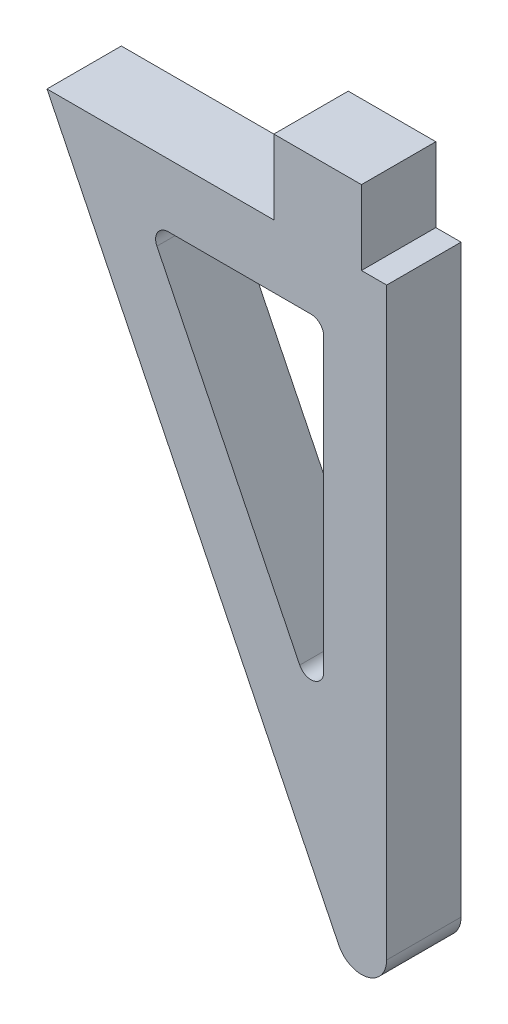
ISO-10303-21;
HEADER;
FILE_DESCRIPTION(('STEP AP214'),'2;1');
FILE_NAME('part.step','',(''),(''),'','','');
FILE_SCHEMA(('AUTOMOTIVE_DESIGN { 1 0 10303 214 1 1 1 1 }'));
ENDSEC;
DATA;
#1=APPLICATION_CONTEXT('core data for automotive mechanical design processes');
#2=APPLICATION_PROTOCOL_DEFINITION('international standard','automotive_design',2000,#1);
#3=PRODUCT_CONTEXT('',#1,'mechanical');
#4=PRODUCT('Part','Part','',(#3));
#5=PRODUCT_RELATED_PRODUCT_CATEGORY('part','',(#4));
#6=PRODUCT_DEFINITION_FORMATION('','',#4);
#7=PRODUCT_DEFINITION_CONTEXT('part definition',#1,'design');
#8=PRODUCT_DEFINITION('design','',#6,#7);
#9=PRODUCT_DEFINITION_SHAPE('','',#8);
#10=(LENGTH_UNIT() NAMED_UNIT(*) SI_UNIT(.MILLI.,.METRE.));
#11=(NAMED_UNIT(*) PLANE_ANGLE_UNIT() SI_UNIT($,.RADIAN.));
#12=(NAMED_UNIT(*) SI_UNIT($,.STERADIAN.) SOLID_ANGLE_UNIT());
#13=UNCERTAINTY_MEASURE_WITH_UNIT(LENGTH_MEASURE(1.E-05),#10,'distance_accuracy_value','');
#14=(GEOMETRIC_REPRESENTATION_CONTEXT(3) GLOBAL_UNCERTAINTY_ASSIGNED_CONTEXT((#13)) GLOBAL_UNIT_ASSIGNED_CONTEXT((#10,
#11,#12)) REPRESENTATION_CONTEXT('',''));
#15=CARTESIAN_POINT('',(0.,0.,0.));
#16=DIRECTION('',(0.,0.,1.));
#17=DIRECTION('',(1.,0.,0.));
#18=AXIS2_PLACEMENT_3D('',#15,#16,#17);
#19=CARTESIAN_POINT('',(0.,0.,5.9));
#20=DIRECTION('',(0.,0.,-1.));
#21=DIRECTION('',(-1.,0.,0.));
#22=AXIS2_PLACEMENT_3D('',#19,#20,#21);
#23=PLANE('',#22);
#24=DIRECTION('',(0.440015247772983,-0.897990301577517,0.));
#25=VECTOR('',#24,1.);
#26=CARTESIAN_POINT('',(8.95000000000001,-60.9,5.9));
#27=LINE('',#26,#25);
#28=CARTESIAN_POINT('',(-18.,-5.9,5.9));
#29=VERTEX_POINT('',#28);
#30=CARTESIAN_POINT('',(5.15401939684497,-53.1531008098877,5.9));
#31=VERTEX_POINT('',#30);
#32=EDGE_CURVE('E145',#29,#31,#27,.T.);
#33=ORIENTED_EDGE('',*,*,#32,.T.);
#34=CARTESIAN_POINT('',(6.95000000000001,-52.2730703143417,5.9));
#35=DIRECTION('',(0.,0.,-1.));
#36=DIRECTION('',(-1.,0.,0.));
#37=AXIS2_PLACEMENT_3D('',#34,#35,#36);
#38=CIRCLE('',#37,2.);
#39=CARTESIAN_POINT('',(8.95,-52.2730703143417,5.9));
#40=VERTEX_POINT('',#39);
#41=EDGE_CURVE('E171',#31,#40,#38,.F.);
#42=ORIENTED_EDGE('',*,*,#41,.T.);
#43=DIRECTION('',(0.,1.,0.));
#44=VECTOR('',#43,1.);
#45=CARTESIAN_POINT('',(8.95,-5.9,5.9));
#46=LINE('',#45,#44);
#47=CARTESIAN_POINT('',(8.95,-5.9,5.9));
#48=VERTEX_POINT('',#47);
#49=EDGE_CURVE('E226',#40,#48,#46,.T.);
#50=ORIENTED_EDGE('',*,*,#49,.T.);
#51=DIRECTION('',(-1.,0.,0.));
#52=VECTOR('',#51,1.);
#53=CARTESIAN_POINT('',(6.95,-5.9,5.9));
#54=LINE('',#53,#52);
#55=CARTESIAN_POINT('',(6.95,-5.9,5.9));
#56=VERTEX_POINT('',#55);
#57=EDGE_CURVE('E228',#48,#56,#54,.T.);
#58=ORIENTED_EDGE('',*,*,#57,.T.);
#59=DIRECTION('',(0.,1.,0.));
#60=VECTOR('',#59,1.);
#61=CARTESIAN_POINT('',(6.95,0.,5.9));
#62=LINE('',#61,#60);
#63=CARTESIAN_POINT('',(6.95,0.,5.9));
#64=VERTEX_POINT('',#63);
#65=EDGE_CURVE('E230',#56,#64,#62,.T.);
#66=ORIENTED_EDGE('',*,*,#65,.T.);
#67=DIRECTION('',(-1.,0.,0.));
#68=VECTOR('',#67,1.);
#69=CARTESIAN_POINT('',(0.,0.,5.9));
#70=LINE('',#69,#68);
#71=CARTESIAN_POINT('',(0.,0.,5.9));
#72=VERTEX_POINT('',#71);
#73=EDGE_CURVE('E150',#64,#72,#70,.T.);
#74=ORIENTED_EDGE('',*,*,#73,.T.);
#75=DIRECTION('',(0.,-1.,0.));
#76=VECTOR('',#75,1.);
#77=CARTESIAN_POINT('',(0.,-5.9,5.9));
#78=LINE('',#77,#76);
#79=CARTESIAN_POINT('',(0.,-5.9,5.9));
#80=VERTEX_POINT('',#79);
#81=EDGE_CURVE('E146',#72,#80,#78,.T.);
#82=ORIENTED_EDGE('',*,*,#81,.T.);
#83=DIRECTION('',(-1.,0.,0.));
#84=VECTOR('',#83,1.);
#85=CARTESIAN_POINT('',(-18.,-5.9,5.9));
#86=LINE('',#85,#84);
#87=EDGE_CURVE('E134',#80,#29,#86,.T.);
#88=ORIENTED_EDGE('',*,*,#87,.T.);
#89=EDGE_LOOP('',(#33,#42,#50,#58,#66,#74,#82,#88));
#90=FACE_BOUND('',#89,.T.);
#91=DIRECTION('',(0.440015247772983,-0.897990301577517,0.));
#92=VECTOR('',#91,1.);
#93=CARTESIAN_POINT('',(-9.9820111350686,-10.9,5.9));
#94=LINE('',#93,#92);
#95=CARTESIAN_POINT('',(-9.27640366365984,-12.340015247773,5.9));
#96=VERTEX_POINT('',#95);
#97=CARTESIAN_POINT('',(2.05200969842248,-35.4592261907981,5.9));
#98=VERTEX_POINT('',#97);
#99=EDGE_CURVE('E219',#96,#98,#94,.T.);
#100=ORIENTED_EDGE('',*,*,#99,.F.);
#101=CARTESIAN_POINT('',(-8.37841336208232,-11.9,5.9));
#102=DIRECTION('',(0.,0.,-1.));
#103=DIRECTION('',(-1.,0.,0.));
#104=AXIS2_PLACEMENT_3D('',#101,#102,#103);
#105=CIRCLE('',#104,1.);
#106=CARTESIAN_POINT('',(-8.37841336208232,-10.9,5.9));
#107=VERTEX_POINT('',#106);
#108=EDGE_CURVE('E11',#96,#107,#105,.T.);
#109=ORIENTED_EDGE('',*,*,#108,.T.);
#110=DIRECTION('',(-1.,0.,0.));
#111=VECTOR('',#110,1.);
#112=CARTESIAN_POINT('',(-9.9820111350686,-10.9,5.9));
#113=LINE('',#112,#111);
#114=CARTESIAN_POINT('',(2.95,-10.9,5.9));
#115=VERTEX_POINT('',#114);
#116=EDGE_CURVE('E212',#115,#107,#113,.T.);
#117=ORIENTED_EDGE('',*,*,#116,.F.);
#118=CARTESIAN_POINT('',(2.95,-11.9,5.9));
#119=DIRECTION('',(0.,0.,-1.));
#120=DIRECTION('',(-1.,0.,0.));
#121=AXIS2_PLACEMENT_3D('',#118,#119,#120);
#122=CIRCLE('',#121,1.);
#123=CARTESIAN_POINT('',(3.95,-11.9,5.9));
#124=VERTEX_POINT('',#123);
#125=EDGE_CURVE('E193',#115,#124,#122,.T.);
#126=ORIENTED_EDGE('',*,*,#125,.T.);
#127=DIRECTION('',(0.,1.,0.));
#128=VECTOR('',#127,1.);
#129=CARTESIAN_POINT('',(3.95,-10.9,5.9));
#130=LINE('',#129,#128);
#131=CARTESIAN_POINT('',(3.95,-35.0192109430251,5.9));
#132=VERTEX_POINT('',#131);
#133=EDGE_CURVE('E214',#132,#124,#130,.T.);
#134=ORIENTED_EDGE('',*,*,#133,.F.);
#135=CARTESIAN_POINT('',(2.95,-35.0192109430251,5.9));
#136=DIRECTION('',(0.,0.,-1.));
#137=DIRECTION('',(-1.,0.,0.));
#138=AXIS2_PLACEMENT_3D('',#135,#136,#137);
#139=CIRCLE('',#138,1.);
#140=EDGE_CURVE('E189',#132,#98,#139,.T.);
#141=ORIENTED_EDGE('',*,*,#140,.T.);
#142=EDGE_LOOP('',(#100,#109,#117,#126,#134,#141));
#143=FACE_BOUND('',#142,.T.);
#144=ADVANCED_FACE('F33',(#90,#143),#23,.F.);
#145=CARTESIAN_POINT('',(0.,0.,0.));
#146=DIRECTION('',(0.,0.,-1.));
#147=DIRECTION('',(-1.,0.,0.));
#148=AXIS2_PLACEMENT_3D('',#145,#146,#147);
#149=PLANE('',#148);
#150=DIRECTION('',(0.,1.,0.));
#151=VECTOR('',#150,1.);
#152=CARTESIAN_POINT('',(8.95,-5.9,0.));
#153=LINE('',#152,#151);
#154=CARTESIAN_POINT('',(8.95,-52.2730703143417,0.));
#155=VERTEX_POINT('',#154);
#156=CARTESIAN_POINT('',(8.95,-5.9,0.));
#157=VERTEX_POINT('',#156);
#158=EDGE_CURVE('E238',#155,#157,#153,.T.);
#159=ORIENTED_EDGE('',*,*,#158,.F.);
#160=CARTESIAN_POINT('',(6.95000000000001,-52.2730703143417,0.));
#161=DIRECTION('',(0.,0.,-1.));
#162=DIRECTION('',(-1.,0.,0.));
#163=AXIS2_PLACEMENT_3D('',#160,#161,#162);
#164=CIRCLE('',#163,2.);
#165=CARTESIAN_POINT('',(5.15401939684497,-53.1531008098877,0.));
#166=VERTEX_POINT('',#165);
#167=EDGE_CURVE('E162',#155,#166,#164,.T.);
#168=ORIENTED_EDGE('',*,*,#167,.T.);
#169=DIRECTION('',(0.440015247772983,-0.897990301577517,0.));
#170=VECTOR('',#169,1.);
#171=CARTESIAN_POINT('',(8.95000000000001,-60.9,0.));
#172=LINE('',#171,#170);
#173=CARTESIAN_POINT('',(-18.,-5.9,0.));
#174=VERTEX_POINT('',#173);
#175=EDGE_CURVE('E235',#174,#166,#172,.T.);
#176=ORIENTED_EDGE('',*,*,#175,.F.);
#177=DIRECTION('',(-1.,0.,0.));
#178=VECTOR('',#177,1.);
#179=CARTESIAN_POINT('',(-18.,-5.9,0.));
#180=LINE('',#179,#178);
#181=CARTESIAN_POINT('',(0.,-5.9,0.));
#182=VERTEX_POINT('',#181);
#183=EDGE_CURVE('E216',#182,#174,#180,.T.);
#184=ORIENTED_EDGE('',*,*,#183,.F.);
#185=DIRECTION('',(0.,-1.,0.));
#186=VECTOR('',#185,1.);
#187=CARTESIAN_POINT('',(0.,-5.9,0.));
#188=LINE('',#187,#186);
#189=CARTESIAN_POINT('',(0.,0.,0.));
#190=VERTEX_POINT('',#189);
#191=EDGE_CURVE('E158',#190,#182,#188,.T.);
#192=ORIENTED_EDGE('',*,*,#191,.F.);
#193=DIRECTION('',(-1.,0.,0.));
#194=VECTOR('',#193,1.);
#195=CARTESIAN_POINT('',(0.,0.,0.));
#196=LINE('',#195,#194);
#197=CARTESIAN_POINT('',(6.95,0.,0.));
#198=VERTEX_POINT('',#197);
#199=EDGE_CURVE('E154',#198,#190,#196,.T.);
#200=ORIENTED_EDGE('',*,*,#199,.F.);
#201=DIRECTION('',(0.,1.,0.));
#202=VECTOR('',#201,1.);
#203=CARTESIAN_POINT('',(6.95,0.,0.));
#204=LINE('',#203,#202);
#205=CARTESIAN_POINT('',(6.95,-5.9,0.));
#206=VERTEX_POINT('',#205);
#207=EDGE_CURVE('E242',#206,#198,#204,.T.);
#208=ORIENTED_EDGE('',*,*,#207,.F.);
#209=DIRECTION('',(-1.,0.,0.));
#210=VECTOR('',#209,1.);
#211=CARTESIAN_POINT('',(6.95,-5.9,0.));
#212=LINE('',#211,#210);
#213=EDGE_CURVE('E240',#157,#206,#212,.T.);
#214=ORIENTED_EDGE('',*,*,#213,.F.);
#215=EDGE_LOOP('',(#159,#168,#176,#184,#192,#200,#208,#214));
#216=FACE_BOUND('',#215,.T.);
#217=DIRECTION('',(0.,1.,0.));
#218=VECTOR('',#217,1.);
#219=CARTESIAN_POINT('',(3.95,-10.9,0.));
#220=LINE('',#219,#218);
#221=CARTESIAN_POINT('',(3.95,-35.0192109430251,0.));
#222=VERTEX_POINT('',#221);
#223=CARTESIAN_POINT('',(3.95,-11.9,0.));
#224=VERTEX_POINT('',#223);
#225=EDGE_CURVE('E209',#222,#224,#220,.T.);
#226=ORIENTED_EDGE('',*,*,#225,.T.);
#227=CARTESIAN_POINT('',(2.95,-11.9,0.));
#228=DIRECTION('',(0.,0.,-1.));
#229=DIRECTION('',(-1.,0.,0.));
#230=AXIS2_PLACEMENT_3D('',#227,#228,#229);
#231=CIRCLE('',#230,1.);
#232=CARTESIAN_POINT('',(2.95,-10.9,0.));
#233=VERTEX_POINT('',#232);
#234=EDGE_CURVE('E191',#224,#233,#231,.F.);
#235=ORIENTED_EDGE('',*,*,#234,.T.);
#236=DIRECTION('',(-1.,0.,0.));
#237=VECTOR('',#236,1.);
#238=CARTESIAN_POINT('',(-9.9820111350686,-10.9,0.));
#239=LINE('',#238,#237);
#240=CARTESIAN_POINT('',(-8.37841336208232,-10.9,0.));
#241=VERTEX_POINT('',#240);
#242=EDGE_CURVE('E201',#233,#241,#239,.T.);
#243=ORIENTED_EDGE('',*,*,#242,.T.);
#244=CARTESIAN_POINT('',(-8.37841336208232,-11.9,0.));
#245=DIRECTION('',(0.,0.,-1.));
#246=DIRECTION('',(-1.,0.,0.));
#247=AXIS2_PLACEMENT_3D('',#244,#245,#246);
#248=CIRCLE('',#247,1.);
#249=CARTESIAN_POINT('',(-9.27640366365984,-12.340015247773,0.));
#250=VERTEX_POINT('',#249);
#251=EDGE_CURVE('E41',#241,#250,#248,.F.);
#252=ORIENTED_EDGE('',*,*,#251,.T.);
#253=DIRECTION('',(0.440015247772983,-0.897990301577517,0.));
#254=VECTOR('',#253,1.);
#255=CARTESIAN_POINT('',(-9.9820111350686,-10.9,0.));
#256=LINE('',#255,#254);
#257=CARTESIAN_POINT('',(2.05200969842248,-35.4592261907981,0.));
#258=VERTEX_POINT('',#257);
#259=EDGE_CURVE('E200',#250,#258,#256,.T.);
#260=ORIENTED_EDGE('',*,*,#259,.T.);
#261=CARTESIAN_POINT('',(2.95,-35.0192109430251,0.));
#262=DIRECTION('',(0.,0.,-1.));
#263=DIRECTION('',(-1.,0.,0.));
#264=AXIS2_PLACEMENT_3D('',#261,#262,#263);
#265=CIRCLE('',#264,1.);
#266=EDGE_CURVE('E187',#258,#222,#265,.F.);
#267=ORIENTED_EDGE('',*,*,#266,.T.);
#268=EDGE_LOOP('',(#226,#235,#243,#252,#260,#267));
#269=FACE_BOUND('',#268,.T.);
#270=ADVANCED_FACE('F199',(#216,#269),#149,.T.);
#271=CARTESIAN_POINT('',(0.,-5.9,5.9));
#272=DIRECTION('',(1.,0.,0.));
#273=DIRECTION('',(0.,0.,-1.));
#274=AXIS2_PLACEMENT_3D('',#271,#272,#273);
#275=PLANE('',#274);
#276=ORIENTED_EDGE('',*,*,#191,.T.);
#277=DIRECTION('',(0.,0.,-1.));
#278=VECTOR('',#277,1.);
#279=CARTESIAN_POINT('',(0.,-5.9,5.9));
#280=LINE('',#279,#278);
#281=EDGE_CURVE('E138',#80,#182,#280,.T.);
#282=ORIENTED_EDGE('',*,*,#281,.F.);
#283=ORIENTED_EDGE('',*,*,#81,.F.);
#284=DIRECTION('',(0.,0.,-1.));
#285=VECTOR('',#284,1.);
#286=CARTESIAN_POINT('',(0.,0.,5.9));
#287=LINE('',#286,#285);
#288=EDGE_CURVE('E232',#72,#190,#287,.T.);
#289=ORIENTED_EDGE('',*,*,#288,.T.);
#290=EDGE_LOOP('',(#276,#282,#283,#289));
#291=FACE_BOUND('',#290,.T.);
#292=ADVANCED_FACE('F156',(#291),#275,.F.);
#293=CARTESIAN_POINT('',(-18.,-5.9,5.9));
#294=DIRECTION('',(0.,-1.,0.));
#295=DIRECTION('',(0.,0.,-1.));
#296=AXIS2_PLACEMENT_3D('',#293,#294,#295);
#297=PLANE('',#296);
#298=ORIENTED_EDGE('',*,*,#183,.T.);
#299=DIRECTION('',(0.,0.,-1.));
#300=VECTOR('',#299,1.);
#301=CARTESIAN_POINT('',(-18.,-5.9,5.9));
#302=LINE('',#301,#300);
#303=EDGE_CURVE('E141',#29,#174,#302,.T.);
#304=ORIENTED_EDGE('',*,*,#303,.F.);
#305=ORIENTED_EDGE('',*,*,#87,.F.);
#306=ORIENTED_EDGE('',*,*,#281,.T.);
#307=EDGE_LOOP('',(#298,#304,#305,#306));
#308=FACE_BOUND('',#307,.T.);
#309=ADVANCED_FACE('F136',(#308),#297,.F.);
#310=CARTESIAN_POINT('',(8.95000000000001,-60.9,5.9));
#311=DIRECTION('',(0.897990301577517,0.440015247772983,0.));
#312=DIRECTION('',(-0.440015247772983,0.897990301577517,0.));
#313=AXIS2_PLACEMENT_3D('',#310,#311,#312);
#314=PLANE('',#313);
#315=ORIENTED_EDGE('',*,*,#175,.T.);
#316=DIRECTION('',(0.,0.,-1.));
#317=VECTOR('',#316,1.);
#318=CARTESIAN_POINT('',(5.15401939684497,-53.1531008098877,5.9));
#319=LINE('',#318,#317);
#320=EDGE_CURVE('E169',#166,#31,#319,.F.);
#321=ORIENTED_EDGE('',*,*,#320,.T.);
#322=ORIENTED_EDGE('',*,*,#32,.F.);
#323=ORIENTED_EDGE('',*,*,#303,.T.);
#324=EDGE_LOOP('',(#315,#321,#322,#323));
#325=FACE_BOUND('',#324,.T.);
#326=ADVANCED_FACE('F272',(#325),#314,.F.);
#327=CARTESIAN_POINT('',(8.95,-5.9,5.9));
#328=DIRECTION('',(-1.,0.,0.));
#329=DIRECTION('',(0.,-1.,0.));
#330=AXIS2_PLACEMENT_3D('',#327,#328,#329);
#331=PLANE('',#330);
#332=ORIENTED_EDGE('',*,*,#49,.F.);
#333=DIRECTION('',(0.,0.,-1.));
#334=VECTOR('',#333,1.);
#335=CARTESIAN_POINT('',(8.95,-52.2730703143417,5.9));
#336=LINE('',#335,#334);
#337=EDGE_CURVE('E159',#40,#155,#336,.T.);
#338=ORIENTED_EDGE('',*,*,#337,.T.);
#339=ORIENTED_EDGE('',*,*,#158,.T.);
#340=DIRECTION('',(0.,0.,-1.));
#341=VECTOR('',#340,1.);
#342=CARTESIAN_POINT('',(8.95,-5.9,5.9));
#343=LINE('',#342,#341);
#344=EDGE_CURVE('E164',#48,#157,#343,.T.);
#345=ORIENTED_EDGE('',*,*,#344,.F.);
#346=EDGE_LOOP('',(#332,#338,#339,#345));
#347=FACE_BOUND('',#346,.T.);
#348=ADVANCED_FACE('F278',(#347),#331,.F.);
#349=CARTESIAN_POINT('',(6.95,-5.9,5.9));
#350=DIRECTION('',(0.,-1.,0.));
#351=DIRECTION('',(0.,0.,-1.));
#352=AXIS2_PLACEMENT_3D('',#349,#350,#351);
#353=PLANE('',#352);
#354=ORIENTED_EDGE('',*,*,#213,.T.);
#355=DIRECTION('',(0.,0.,-1.));
#356=VECTOR('',#355,1.);
#357=CARTESIAN_POINT('',(6.95,-5.9,5.9));
#358=LINE('',#357,#356);
#359=EDGE_CURVE('E249',#56,#206,#358,.T.);
#360=ORIENTED_EDGE('',*,*,#359,.F.);
#361=ORIENTED_EDGE('',*,*,#57,.F.);
#362=ORIENTED_EDGE('',*,*,#344,.T.);
#363=EDGE_LOOP('',(#354,#360,#361,#362));
#364=FACE_BOUND('',#363,.T.);
#365=ADVANCED_FACE('F256',(#364),#353,.F.);
#366=CARTESIAN_POINT('',(6.95,0.,5.9));
#367=DIRECTION('',(-1.,0.,0.));
#368=DIRECTION('',(0.,0.,1.));
#369=AXIS2_PLACEMENT_3D('',#366,#367,#368);
#370=PLANE('',#369);
#371=ORIENTED_EDGE('',*,*,#207,.T.);
#372=DIRECTION('',(0.,0.,-1.));
#373=VECTOR('',#372,1.);
#374=CARTESIAN_POINT('',(6.95,0.,5.9));
#375=LINE('',#374,#373);
#376=EDGE_CURVE('E246',#64,#198,#375,.T.);
#377=ORIENTED_EDGE('',*,*,#376,.F.);
#378=ORIENTED_EDGE('',*,*,#65,.F.);
#379=ORIENTED_EDGE('',*,*,#359,.T.);
#380=EDGE_LOOP('',(#371,#377,#378,#379));
#381=FACE_BOUND('',#380,.T.);
#382=ADVANCED_FACE('F266',(#381),#370,.F.);
#383=CARTESIAN_POINT('',(0.,0.,5.9));
#384=DIRECTION('',(0.,-1.,0.));
#385=DIRECTION('',(0.,0.,-1.));
#386=AXIS2_PLACEMENT_3D('',#383,#384,#385);
#387=PLANE('',#386);
#388=ORIENTED_EDGE('',*,*,#199,.T.);
#389=ORIENTED_EDGE('',*,*,#288,.F.);
#390=ORIENTED_EDGE('',*,*,#73,.F.);
#391=ORIENTED_EDGE('',*,*,#376,.T.);
#392=EDGE_LOOP('',(#388,#389,#390,#391));
#393=FACE_BOUND('',#392,.T.);
#394=ADVANCED_FACE('F269',(#393),#387,.F.);
#395=CARTESIAN_POINT('',(-9.9820111350686,-10.9,5.9));
#396=DIRECTION('',(0.897990301577517,0.440015247772984,0.));
#397=DIRECTION('',(-0.440015247772984,0.897990301577517,0.));
#398=AXIS2_PLACEMENT_3D('',#395,#396,#397);
#399=PLANE('',#398);
#400=ORIENTED_EDGE('',*,*,#99,.T.);
#401=DIRECTION('',(0.,0.,-1.));
#402=VECTOR('',#401,1.);
#403=CARTESIAN_POINT('',(2.05200969842249,-35.4592261907981,0.));
#404=LINE('',#403,#402);
#405=EDGE_CURVE('E175',#98,#258,#404,.T.);
#406=ORIENTED_EDGE('',*,*,#405,.T.);
#407=ORIENTED_EDGE('',*,*,#259,.F.);
#408=DIRECTION('',(0.,0.,-1.));
#409=VECTOR('',#408,1.);
#410=CARTESIAN_POINT('',(-9.27640366365984,-12.340015247773,5.9));
#411=LINE('',#410,#409);
#412=EDGE_CURVE('E173',#250,#96,#411,.F.);
#413=ORIENTED_EDGE('',*,*,#412,.T.);
#414=EDGE_LOOP('',(#400,#406,#407,#413));
#415=FACE_BOUND('',#414,.T.);
#416=ADVANCED_FACE('F207',(#415),#399,.T.);
#417=CARTESIAN_POINT('',(3.95,-10.9,5.9));
#418=DIRECTION('',(-1.,0.,0.));
#419=DIRECTION('',(0.,-1.,0.));
#420=AXIS2_PLACEMENT_3D('',#417,#418,#419);
#421=PLANE('',#420);
#422=ORIENTED_EDGE('',*,*,#225,.F.);
#423=DIRECTION('',(0.,0.,-1.));
#424=VECTOR('',#423,1.);
#425=CARTESIAN_POINT('',(3.95,-35.0192109430251,5.9));
#426=LINE('',#425,#424);
#427=EDGE_CURVE('E181',#222,#132,#426,.F.);
#428=ORIENTED_EDGE('',*,*,#427,.T.);
#429=ORIENTED_EDGE('',*,*,#133,.T.);
#430=DIRECTION('',(0.,0.,-1.));
#431=VECTOR('',#430,1.);
#432=CARTESIAN_POINT('',(3.95,-11.9,0.));
#433=LINE('',#432,#431);
#434=EDGE_CURVE('E178',#124,#224,#433,.T.);
#435=ORIENTED_EDGE('',*,*,#434,.T.);
#436=EDGE_LOOP('',(#422,#428,#429,#435));
#437=FACE_BOUND('',#436,.T.);
#438=ADVANCED_FACE('F314',(#437),#421,.T.);
#439=CARTESIAN_POINT('',(-9.9820111350686,-10.9,5.9));
#440=DIRECTION('',(0.,-1.,0.));
#441=DIRECTION('',(0.,0.,-1.));
#442=AXIS2_PLACEMENT_3D('',#439,#440,#441);
#443=PLANE('',#442);
#444=ORIENTED_EDGE('',*,*,#242,.F.);
#445=DIRECTION('',(0.,0.,-1.));
#446=VECTOR('',#445,1.);
#447=CARTESIAN_POINT('',(2.95,-10.9,5.9));
#448=LINE('',#447,#446);
#449=EDGE_CURVE('E53',#233,#115,#448,.F.);
#450=ORIENTED_EDGE('',*,*,#449,.T.);
#451=ORIENTED_EDGE('',*,*,#116,.T.);
#452=DIRECTION('',(0.,0.,-1.));
#453=VECTOR('',#452,1.);
#454=CARTESIAN_POINT('',(-8.37841336208232,-10.9,0.));
#455=LINE('',#454,#453);
#456=EDGE_CURVE('E183',#107,#241,#455,.T.);
#457=ORIENTED_EDGE('',*,*,#456,.T.);
#458=EDGE_LOOP('',(#444,#450,#451,#457));
#459=FACE_BOUND('',#458,.T.);
#460=ADVANCED_FACE('F211',(#459),#443,.T.);
#461=CARTESIAN_POINT('',(6.95000000000001,-52.2730703143417,5.9));
#462=DIRECTION('',(0.,0.,-1.));
#463=DIRECTION('',(-1.,0.,0.));
#464=AXIS2_PLACEMENT_3D('',#461,#462,#463);
#465=CYLINDRICAL_SURFACE('',#464,2.);
#466=ORIENTED_EDGE('',*,*,#41,.F.);
#467=ORIENTED_EDGE('',*,*,#320,.F.);
#468=ORIENTED_EDGE('',*,*,#167,.F.);
#469=ORIENTED_EDGE('',*,*,#337,.F.);
#470=EDGE_LOOP('',(#466,#467,#468,#469));
#471=FACE_BOUND('',#470,.T.);
#472=ADVANCED_FACE('F277',(#471),#465,.T.);
#473=CARTESIAN_POINT('',(2.95,-35.0192109430251,5.9));
#474=DIRECTION('',(0.,0.,1.));
#475=DIRECTION('',(1.,0.,0.));
#476=AXIS2_PLACEMENT_3D('',#473,#474,#475);
#477=CYLINDRICAL_SURFACE('',#476,1.);
#478=ORIENTED_EDGE('',*,*,#140,.F.);
#479=ORIENTED_EDGE('',*,*,#427,.F.);
#480=ORIENTED_EDGE('',*,*,#266,.F.);
#481=ORIENTED_EDGE('',*,*,#405,.F.);
#482=EDGE_LOOP('',(#478,#479,#480,#481));
#483=FACE_BOUND('',#482,.T.);
#484=ADVANCED_FACE('F334',(#483),#477,.F.);
#485=CARTESIAN_POINT('',(2.95,-11.9,5.9));
#486=DIRECTION('',(0.,0.,1.));
#487=DIRECTION('',(1.,0.,0.));
#488=AXIS2_PLACEMENT_3D('',#485,#486,#487);
#489=CYLINDRICAL_SURFACE('',#488,1.);
#490=ORIENTED_EDGE('',*,*,#125,.F.);
#491=ORIENTED_EDGE('',*,*,#449,.F.);
#492=ORIENTED_EDGE('',*,*,#234,.F.);
#493=ORIENTED_EDGE('',*,*,#434,.F.);
#494=EDGE_LOOP('',(#490,#491,#492,#493));
#495=FACE_BOUND('',#494,.T.);
#496=ADVANCED_FACE('F340',(#495),#489,.F.);
#497=CARTESIAN_POINT('',(-8.37841336208232,-11.9,5.9));
#498=DIRECTION('',(0.,0.,1.));
#499=DIRECTION('',(1.,0.,0.));
#500=AXIS2_PLACEMENT_3D('',#497,#498,#499);
#501=CYLINDRICAL_SURFACE('',#500,1.);
#502=ORIENTED_EDGE('',*,*,#108,.F.);
#503=ORIENTED_EDGE('',*,*,#412,.F.);
#504=ORIENTED_EDGE('',*,*,#251,.F.);
#505=ORIENTED_EDGE('',*,*,#456,.F.);
#506=EDGE_LOOP('',(#502,#503,#504,#505));
#507=FACE_BOUND('',#506,.T.);
#508=ADVANCED_FACE('F35',(#507),#501,.F.);
#509=CLOSED_SHELL('',(#144,#270,#292,#309,#326,#348,#365,#382,#394,#416,#438,#460,#472,#484,
#496,#508));
#510=MANIFOLD_SOLID_BREP('B2',#509);
#511=ADVANCED_BREP_SHAPE_REPRESENTATION('',(#18,#510),#14);
#512=SHAPE_DEFINITION_REPRESENTATION(#9,#511);
ENDSEC;
END-ISO-10303-21;
